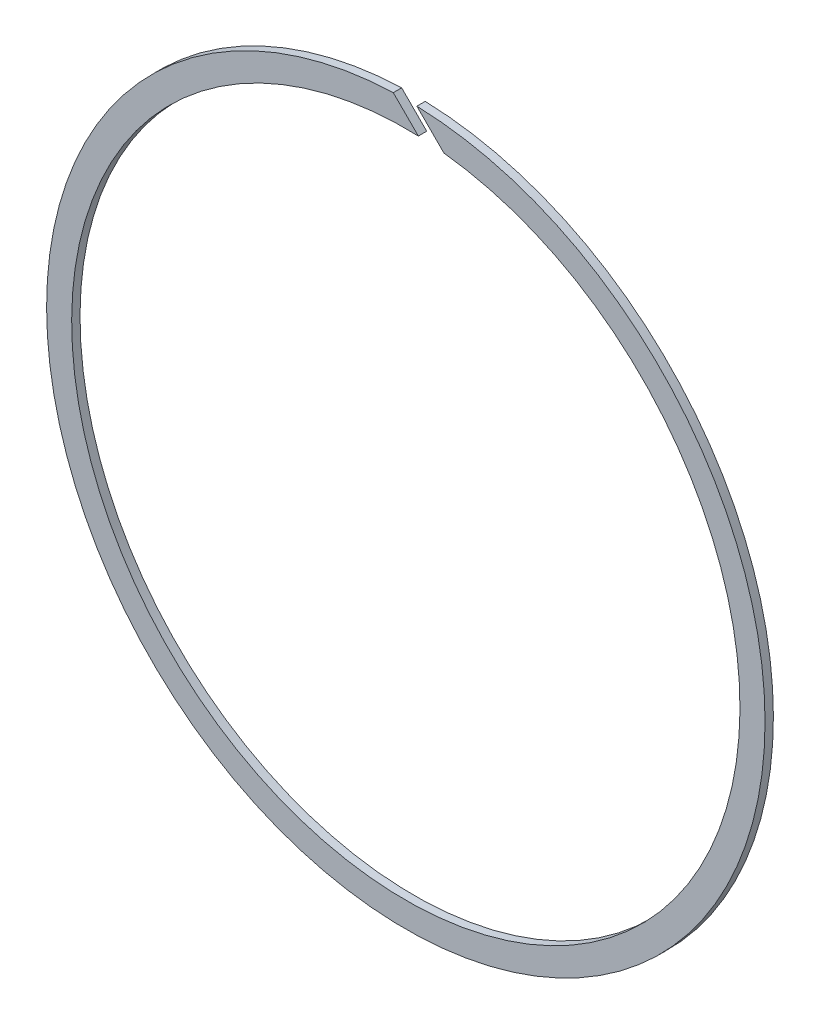
ISO-10303-21;
HEADER;
FILE_DESCRIPTION(('STEP AP214'),'2;1');
FILE_NAME('part.step','',(''),(''),'','','');
FILE_SCHEMA(('AUTOMOTIVE_DESIGN { 1 0 10303 214 1 1 1 1 }'));
ENDSEC;
DATA;
#1=APPLICATION_CONTEXT('core data for automotive mechanical design processes');
#2=APPLICATION_PROTOCOL_DEFINITION('international standard','automotive_design',2000,#1);
#3=PRODUCT_CONTEXT('',#1,'mechanical');
#4=PRODUCT('Part','Part','',(#3));
#5=PRODUCT_RELATED_PRODUCT_CATEGORY('part','',(#4));
#6=PRODUCT_DEFINITION_FORMATION('','',#4);
#7=PRODUCT_DEFINITION_CONTEXT('part definition',#1,'design');
#8=PRODUCT_DEFINITION('design','',#6,#7);
#9=PRODUCT_DEFINITION_SHAPE('','',#8);
#10=(LENGTH_UNIT() NAMED_UNIT(*) SI_UNIT(.MILLI.,.METRE.));
#11=(NAMED_UNIT(*) PLANE_ANGLE_UNIT() SI_UNIT($,.RADIAN.));
#12=(NAMED_UNIT(*) SI_UNIT($,.STERADIAN.) SOLID_ANGLE_UNIT());
#13=UNCERTAINTY_MEASURE_WITH_UNIT(LENGTH_MEASURE(1.E-05),#10,'distance_accuracy_value','');
#14=(GEOMETRIC_REPRESENTATION_CONTEXT(3) GLOBAL_UNCERTAINTY_ASSIGNED_CONTEXT((#13)) GLOBAL_UNIT_ASSIGNED_CONTEXT((#10,
#11,#12)) REPRESENTATION_CONTEXT('',''));
#15=CARTESIAN_POINT('',(0.,0.,0.));
#16=DIRECTION('',(0.,0.,1.));
#17=DIRECTION('',(1.,0.,0.));
#18=AXIS2_PLACEMENT_3D('',#15,#16,#17);
#19=CARTESIAN_POINT('',(0.,0.,0.25));
#20=DIRECTION('',(0.,0.,-1.));
#21=DIRECTION('',(-1.,0.,0.));
#22=AXIS2_PLACEMENT_3D('',#19,#20,#21);
#23=CYLINDRICAL_SURFACE('',#22,21.5);
#24=CARTESIAN_POINT('',(0.,0.,-0.25));
#25=DIRECTION('',(0.,0.,1.));
#26=DIRECTION('',(1.,0.,0.));
#27=AXIS2_PLACEMENT_3D('',#24,#25,#26);
#28=CIRCLE('',#27,21.5);
#29=CARTESIAN_POINT('',(-0.750491679640193,21.4868974549326,-0.25));
#30=VERTEX_POINT('',#29);
#31=CARTESIAN_POINT('',(0.660775798348726,21.4898435393168,-0.25));
#32=VERTEX_POINT('',#31);
#33=EDGE_CURVE('E111',#30,#32,#28,.T.);
#34=ORIENTED_EDGE('',*,*,#33,.T.);
#35=DIRECTION('',(0.,0.,-1.));
#36=VECTOR('',#35,1.);
#37=CARTESIAN_POINT('',(0.660775798348726,21.4898435393168,0.25));
#38=LINE('',#37,#36);
#39=CARTESIAN_POINT('',(0.660775798348726,21.4898435393168,0.25));
#40=VERTEX_POINT('',#39);
#41=EDGE_CURVE('E11',#40,#32,#38,.T.);
#42=ORIENTED_EDGE('',*,*,#41,.F.);
#43=CARTESIAN_POINT('',(0.,0.,0.25));
#44=DIRECTION('',(0.,0.,1.));
#45=DIRECTION('',(1.,0.,0.));
#46=AXIS2_PLACEMENT_3D('',#43,#44,#45);
#47=CIRCLE('',#46,21.5);
#48=CARTESIAN_POINT('',(-0.750491679640193,21.4868974549326,0.25));
#49=VERTEX_POINT('',#48);
#50=EDGE_CURVE('E95',#49,#40,#47,.T.);
#51=ORIENTED_EDGE('',*,*,#50,.F.);
#52=DIRECTION('',(0.,0.,-1.));
#53=VECTOR('',#52,1.);
#54=CARTESIAN_POINT('',(-0.750491679640193,21.4868974549326,0.25));
#55=LINE('',#54,#53);
#56=EDGE_CURVE('E107',#49,#30,#55,.T.);
#57=ORIENTED_EDGE('',*,*,#56,.T.);
#58=EDGE_LOOP('',(#34,#42,#51,#57));
#59=FACE_BOUND('',#58,.T.);
#60=ADVANCED_FACE('F43',(#59),#23,.T.);
#61=CARTESIAN_POINT('',(0.660775798348726,21.4898435393168,0.25));
#62=DIRECTION('',(0.707106781186551,0.707106781186544,0.));
#63=DIRECTION('',(-0.707106781186544,0.707106781186551,0.));
#64=AXIS2_PLACEMENT_3D('',#61,#62,#63);
#65=PLANE('',#64);
#66=DIRECTION('',(0.707106781186544,-0.707106781186551,0.));
#67=VECTOR('',#66,1.);
#68=CARTESIAN_POINT('',(0.660775798348726,21.4898435393168,-0.25));
#69=LINE('',#68,#67);
#70=CARTESIAN_POINT('',(2.28113456598999,19.8694847716755,-0.25));
#71=VERTEX_POINT('',#70);
#72=EDGE_CURVE('E100',#32,#71,#69,.T.);
#73=ORIENTED_EDGE('',*,*,#72,.T.);
#74=DIRECTION('',(0.,0.,-1.));
#75=VECTOR('',#74,1.);
#76=CARTESIAN_POINT('',(2.28113456598999,19.8694847716755,0.25));
#77=LINE('',#76,#75);
#78=CARTESIAN_POINT('',(2.28113456598999,19.8694847716755,0.25));
#79=VERTEX_POINT('',#78);
#80=EDGE_CURVE('E52',#79,#71,#77,.T.);
#81=ORIENTED_EDGE('',*,*,#80,.F.);
#82=DIRECTION('',(0.707106781186544,-0.707106781186551,0.));
#83=VECTOR('',#82,1.);
#84=CARTESIAN_POINT('',(0.660775798348726,21.4898435393168,0.25));
#85=LINE('',#84,#83);
#86=EDGE_CURVE('E90',#40,#79,#85,.T.);
#87=ORIENTED_EDGE('',*,*,#86,.F.);
#88=ORIENTED_EDGE('',*,*,#41,.T.);
#89=EDGE_LOOP('',(#73,#81,#87,#88));
#90=FACE_BOUND('',#89,.T.);
#91=ADVANCED_FACE('F99',(#90),#65,.F.);
#92=CARTESIAN_POINT('',(0.,0.,0.25));
#93=DIRECTION('',(0.,0.,-1.));
#94=DIRECTION('',(-1.,0.,0.));
#95=AXIS2_PLACEMENT_3D('',#92,#93,#94);
#96=CYLINDRICAL_SURFACE('',#95,20.);
#97=CARTESIAN_POINT('',(0.,0.,-0.25));
#98=DIRECTION('',(0.,0.,-1.));
#99=DIRECTION('',(1.,0.,0.));
#100=AXIS2_PLACEMENT_3D('',#97,#98,#99);
#101=CIRCLE('',#100,20.);
#102=CARTESIAN_POINT('',(0.750491679640193,19.9859140956522,-0.25));
#103=VERTEX_POINT('',#102);
#104=EDGE_CURVE('E77',#71,#103,#101,.T.);
#105=ORIENTED_EDGE('',*,*,#104,.T.);
#106=DIRECTION('',(0.,0.,-1.));
#107=VECTOR('',#106,1.);
#108=CARTESIAN_POINT('',(0.750491679640193,19.9859140956522,0.25));
#109=LINE('',#108,#107);
#110=CARTESIAN_POINT('',(0.750491679640193,19.9859140956522,0.25));
#111=VERTEX_POINT('',#110);
#112=EDGE_CURVE('E102',#111,#103,#109,.T.);
#113=ORIENTED_EDGE('',*,*,#112,.F.);
#114=CARTESIAN_POINT('',(0.,0.,0.25));
#115=DIRECTION('',(0.,0.,-1.));
#116=DIRECTION('',(1.,0.,0.));
#117=AXIS2_PLACEMENT_3D('',#114,#115,#116);
#118=CIRCLE('',#117,20.);
#119=EDGE_CURVE('E93',#79,#111,#118,.T.);
#120=ORIENTED_EDGE('',*,*,#119,.F.);
#121=ORIENTED_EDGE('',*,*,#80,.T.);
#122=EDGE_LOOP('',(#105,#113,#120,#121));
#123=FACE_BOUND('',#122,.T.);
#124=ADVANCED_FACE('F103',(#123),#96,.F.);
#125=CARTESIAN_POINT('',(-0.750491679640193,21.4868974549326,0.25));
#126=DIRECTION('',(-0.707106781186551,-0.707106781186544,0.));
#127=DIRECTION('',(0.707106781186544,-0.707106781186551,0.));
#128=AXIS2_PLACEMENT_3D('',#125,#126,#127);
#129=PLANE('',#128);
#130=DIRECTION('',(-0.707106781186544,0.707106781186551,0.));
#131=VECTOR('',#130,1.);
#132=CARTESIAN_POINT('',(-0.750491679640193,21.4868974549326,-0.25));
#133=LINE('',#132,#131);
#134=EDGE_CURVE('E83',#103,#30,#133,.T.);
#135=ORIENTED_EDGE('',*,*,#134,.T.);
#136=ORIENTED_EDGE('',*,*,#56,.F.);
#137=DIRECTION('',(-0.707106781186544,0.707106781186551,0.));
#138=VECTOR('',#137,1.);
#139=CARTESIAN_POINT('',(-0.750491679640193,21.4868974549326,0.25));
#140=LINE('',#139,#138);
#141=EDGE_CURVE('E60',#111,#49,#140,.T.);
#142=ORIENTED_EDGE('',*,*,#141,.F.);
#143=ORIENTED_EDGE('',*,*,#112,.T.);
#144=EDGE_LOOP('',(#135,#136,#142,#143));
#145=FACE_BOUND('',#144,.T.);
#146=ADVANCED_FACE('F124',(#145),#129,.F.);
#147=CARTESIAN_POINT('',(0.,0.,0.25));
#148=DIRECTION('',(0.,0.,1.));
#149=DIRECTION('',(1.,0.,0.));
#150=AXIS2_PLACEMENT_3D('',#147,#148,#149);
#151=PLANE('',#150);
#152=ORIENTED_EDGE('',*,*,#50,.T.);
#153=ORIENTED_EDGE('',*,*,#86,.T.);
#154=ORIENTED_EDGE('',*,*,#119,.T.);
#155=ORIENTED_EDGE('',*,*,#141,.T.);
#156=EDGE_LOOP('',(#152,#153,#154,#155));
#157=FACE_BOUND('',#156,.T.);
#158=ADVANCED_FACE('F91',(#157),#151,.T.);
#159=CARTESIAN_POINT('',(0.,0.,-0.25));
#160=DIRECTION('',(0.,0.,1.));
#161=DIRECTION('',(1.,0.,0.));
#162=AXIS2_PLACEMENT_3D('',#159,#160,#161);
#163=PLANE('',#162);
#164=ORIENTED_EDGE('',*,*,#33,.F.);
#165=ORIENTED_EDGE('',*,*,#134,.F.);
#166=ORIENTED_EDGE('',*,*,#104,.F.);
#167=ORIENTED_EDGE('',*,*,#72,.F.);
#168=EDGE_LOOP('',(#164,#165,#166,#167));
#169=FACE_BOUND('',#168,.T.);
#170=ADVANCED_FACE('F127',(#169),#163,.F.);
#171=CLOSED_SHELL('',(#60,#91,#124,#146,#158,#170));
#172=MANIFOLD_SOLID_BREP('B2',#171);
#173=ADVANCED_BREP_SHAPE_REPRESENTATION('',(#18,#172),#14);
#174=SHAPE_DEFINITION_REPRESENTATION(#9,#173);
ENDSEC;
END-ISO-10303-21;
